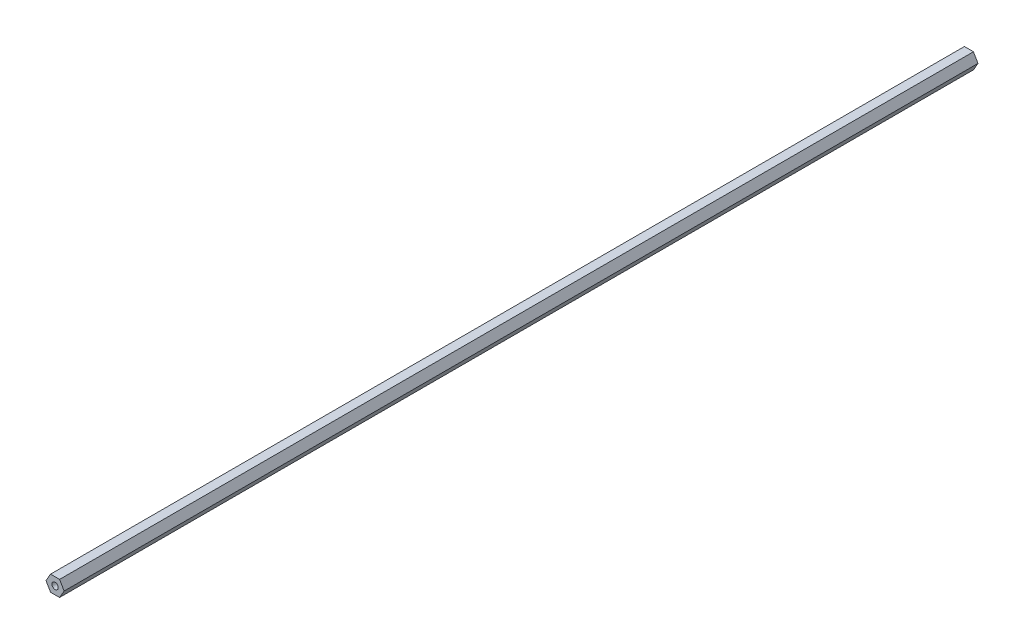
ISO-10303-21;
HEADER;
FILE_DESCRIPTION(('STEP AP214'),'2;1');
FILE_NAME('part.step','',(''),(''),'','','');
FILE_SCHEMA(('AUTOMOTIVE_DESIGN { 1 0 10303 214 1 1 1 1 }'));
ENDSEC;
DATA;
#1=APPLICATION_CONTEXT('core data for automotive mechanical design processes');
#2=APPLICATION_PROTOCOL_DEFINITION('international standard','automotive_design',2000,#1);
#3=PRODUCT_CONTEXT('',#1,'mechanical');
#4=PRODUCT('Part','Part','',(#3));
#5=PRODUCT_RELATED_PRODUCT_CATEGORY('part','',(#4));
#6=PRODUCT_DEFINITION_FORMATION('','',#4);
#7=PRODUCT_DEFINITION_CONTEXT('part definition',#1,'design');
#8=PRODUCT_DEFINITION('design','',#6,#7);
#9=PRODUCT_DEFINITION_SHAPE('','',#8);
#10=(LENGTH_UNIT() NAMED_UNIT(*) SI_UNIT(.MILLI.,.METRE.));
#11=(NAMED_UNIT(*) PLANE_ANGLE_UNIT() SI_UNIT($,.RADIAN.));
#12=(NAMED_UNIT(*) SI_UNIT($,.STERADIAN.) SOLID_ANGLE_UNIT());
#13=UNCERTAINTY_MEASURE_WITH_UNIT(LENGTH_MEASURE(1.E-05),#10,'distance_accuracy_value','');
#14=(GEOMETRIC_REPRESENTATION_CONTEXT(3) GLOBAL_UNCERTAINTY_ASSIGNED_CONTEXT((#13)) GLOBAL_UNIT_ASSIGNED_CONTEXT((#10,
#11,#12)) REPRESENTATION_CONTEXT('',''));
#15=CARTESIAN_POINT('',(0.,0.,0.));
#16=DIRECTION('',(0.,0.,1.));
#17=DIRECTION('',(1.,0.,0.));
#18=AXIS2_PLACEMENT_3D('',#15,#16,#17);
#19=CARTESIAN_POINT('',(0.,0.,739.648));
#20=DIRECTION('',(0.,0.,1.));
#21=DIRECTION('',(1.,0.,0.));
#22=AXIS2_PLACEMENT_3D('',#19,#20,#21);
#23=PLANE('',#22);
#24=DIRECTION('',(1.,0.,0.));
#25=VECTOR('',#24,1.);
#26=CARTESIAN_POINT('',(-3.66617420935412,-6.35,739.648));
#27=LINE('',#26,#25);
#28=CARTESIAN_POINT('',(-3.66617420935412,-6.35,739.648));
#29=VERTEX_POINT('',#28);
#30=CARTESIAN_POINT('',(3.66617420935413,-6.35,739.648));
#31=VERTEX_POINT('',#30);
#32=EDGE_CURVE('E152',#29,#31,#27,.T.);
#33=ORIENTED_EDGE('',*,*,#32,.T.);
#34=DIRECTION('',(0.5,0.866025403784439,0.));
#35=VECTOR('',#34,1.);
#36=CARTESIAN_POINT('',(3.66617420935413,-6.35,739.648));
#37=LINE('',#36,#35);
#38=CARTESIAN_POINT('',(7.33234841870825,0.,739.648));
#39=VERTEX_POINT('',#38);
#40=EDGE_CURVE('E100',#31,#39,#37,.T.);
#41=ORIENTED_EDGE('',*,*,#40,.T.);
#42=DIRECTION('',(-0.500000000000001,0.866025403784438,0.));
#43=VECTOR('',#42,1.);
#44=CARTESIAN_POINT('',(7.33234841870825,0.,739.648));
#45=LINE('',#44,#43);
#46=CARTESIAN_POINT('',(3.66617420935412,6.35,739.648));
#47=VERTEX_POINT('',#46);
#48=EDGE_CURVE('E113',#39,#47,#45,.T.);
#49=ORIENTED_EDGE('',*,*,#48,.T.);
#50=DIRECTION('',(-1.,0.,0.));
#51=VECTOR('',#50,1.);
#52=CARTESIAN_POINT('',(3.66617420935412,6.35,739.648));
#53=LINE('',#52,#51);
#54=CARTESIAN_POINT('',(-3.66617420935413,6.35,739.648));
#55=VERTEX_POINT('',#54);
#56=EDGE_CURVE('E107',#47,#55,#53,.T.);
#57=ORIENTED_EDGE('',*,*,#56,.T.);
#58=DIRECTION('',(-0.5,-0.866025403784439,0.));
#59=VECTOR('',#58,1.);
#60=CARTESIAN_POINT('',(-3.66617420935413,6.35,739.648));
#61=LINE('',#60,#59);
#62=CARTESIAN_POINT('',(-7.33234841870825,0.,739.648));
#63=VERTEX_POINT('',#62);
#64=EDGE_CURVE('E111',#55,#63,#61,.T.);
#65=ORIENTED_EDGE('',*,*,#64,.T.);
#66=DIRECTION('',(0.5,-0.866025403784438,0.));
#67=VECTOR('',#66,1.);
#68=CARTESIAN_POINT('',(-7.33234841870825,0.,739.648));
#69=LINE('',#68,#67);
#70=EDGE_CURVE('E63',#63,#29,#69,.T.);
#71=ORIENTED_EDGE('',*,*,#70,.T.);
#72=EDGE_LOOP('',(#33,#41,#49,#57,#65,#71));
#73=FACE_BOUND('',#72,.T.);
#74=CARTESIAN_POINT('',(0.,0.,739.648));
#75=DIRECTION('',(0.,0.,1.));
#76=DIRECTION('',(1.,0.,0.));
#77=AXIS2_PLACEMENT_3D('',#74,#75,#76);
#78=CIRCLE('',#77,2.5527);
#79=CARTESIAN_POINT('',(2.5527,0.,739.648));
#80=VERTEX_POINT('',#79);
#81=EDGE_CURVE('E140',#80,#80,#78,.T.);
#82=ORIENTED_EDGE('',*,*,#81,.F.);
#83=EDGE_LOOP('',(#82));
#84=FACE_BOUND('',#83,.T.);
#85=ADVANCED_FACE('F45',(#73,#84),#23,.T.);
#86=CARTESIAN_POINT('',(0.,0.,0.));
#87=DIRECTION('',(0.,0.,1.));
#88=DIRECTION('',(1.,0.,0.));
#89=AXIS2_PLACEMENT_3D('',#86,#87,#88);
#90=PLANE('',#89);
#91=DIRECTION('',(1.,0.,0.));
#92=VECTOR('',#91,1.);
#93=CARTESIAN_POINT('',(-3.66617420935412,-6.35,0.));
#94=LINE('',#93,#92);
#95=CARTESIAN_POINT('',(-3.66617420935412,-6.35,0.));
#96=VERTEX_POINT('',#95);
#97=CARTESIAN_POINT('',(3.66617420935413,-6.35,0.));
#98=VERTEX_POINT('',#97);
#99=EDGE_CURVE('E135',#96,#98,#94,.T.);
#100=ORIENTED_EDGE('',*,*,#99,.F.);
#101=DIRECTION('',(0.5,-0.866025403784438,0.));
#102=VECTOR('',#101,1.);
#103=CARTESIAN_POINT('',(-7.33234841870825,0.,0.));
#104=LINE('',#103,#102);
#105=CARTESIAN_POINT('',(-7.33234841870825,0.,0.));
#106=VERTEX_POINT('',#105);
#107=EDGE_CURVE('E92',#106,#96,#104,.T.);
#108=ORIENTED_EDGE('',*,*,#107,.F.);
#109=DIRECTION('',(-0.5,-0.866025403784439,0.));
#110=VECTOR('',#109,1.);
#111=CARTESIAN_POINT('',(-3.66617420935413,6.35,0.));
#112=LINE('',#111,#110);
#113=CARTESIAN_POINT('',(-3.66617420935413,6.35,0.));
#114=VERTEX_POINT('',#113);
#115=EDGE_CURVE('E86',#114,#106,#112,.T.);
#116=ORIENTED_EDGE('',*,*,#115,.F.);
#117=DIRECTION('',(-1.,0.,0.));
#118=VECTOR('',#117,1.);
#119=CARTESIAN_POINT('',(3.66617420935412,6.35,0.));
#120=LINE('',#119,#118);
#121=CARTESIAN_POINT('',(3.66617420935412,6.35,0.));
#122=VERTEX_POINT('',#121);
#123=EDGE_CURVE('E122',#122,#114,#120,.T.);
#124=ORIENTED_EDGE('',*,*,#123,.F.);
#125=DIRECTION('',(-0.500000000000001,0.866025403784438,0.));
#126=VECTOR('',#125,1.);
#127=CARTESIAN_POINT('',(7.33234841870825,0.,0.));
#128=LINE('',#127,#126);
#129=CARTESIAN_POINT('',(7.33234841870825,0.,0.));
#130=VERTEX_POINT('',#129);
#131=EDGE_CURVE('E143',#130,#122,#128,.T.);
#132=ORIENTED_EDGE('',*,*,#131,.F.);
#133=DIRECTION('',(0.5,0.866025403784439,0.));
#134=VECTOR('',#133,1.);
#135=CARTESIAN_POINT('',(3.66617420935413,-6.35,0.));
#136=LINE('',#135,#134);
#137=EDGE_CURVE('E139',#98,#130,#136,.T.);
#138=ORIENTED_EDGE('',*,*,#137,.F.);
#139=EDGE_LOOP('',(#100,#108,#116,#124,#132,#138));
#140=FACE_BOUND('',#139,.T.);
#141=CARTESIAN_POINT('',(0.,0.,0.));
#142=DIRECTION('',(0.,0.,1.));
#143=DIRECTION('',(1.,0.,0.));
#144=AXIS2_PLACEMENT_3D('',#141,#142,#143);
#145=CIRCLE('',#144,2.5527);
#146=CARTESIAN_POINT('',(2.5527,0.,0.));
#147=VERTEX_POINT('',#146);
#148=EDGE_CURVE('E249',#147,#147,#145,.T.);
#149=ORIENTED_EDGE('',*,*,#148,.T.);
#150=EDGE_LOOP('',(#149));
#151=FACE_BOUND('',#150,.T.);
#152=ADVANCED_FACE('F165',(#140,#151),#90,.F.);
#153=CARTESIAN_POINT('',(-3.66617420935412,-6.35,739.648));
#154=DIRECTION('',(0.,1.,0.));
#155=DIRECTION('',(-1.,0.,0.));
#156=AXIS2_PLACEMENT_3D('',#153,#154,#155);
#157=PLANE('',#156);
#158=ORIENTED_EDGE('',*,*,#99,.T.);
#159=DIRECTION('',(0.,0.,-1.));
#160=VECTOR('',#159,1.);
#161=CARTESIAN_POINT('',(3.66617420935413,-6.35,739.648));
#162=LINE('',#161,#160);
#163=EDGE_CURVE('E11',#31,#98,#162,.T.);
#164=ORIENTED_EDGE('',*,*,#163,.F.);
#165=ORIENTED_EDGE('',*,*,#32,.F.);
#166=DIRECTION('',(0.,0.,-1.));
#167=VECTOR('',#166,1.);
#168=CARTESIAN_POINT('',(-3.66617420935412,-6.35,739.648));
#169=LINE('',#168,#167);
#170=EDGE_CURVE('E131',#29,#96,#169,.T.);
#171=ORIENTED_EDGE('',*,*,#170,.T.);
#172=EDGE_LOOP('',(#158,#164,#165,#171));
#173=FACE_BOUND('',#172,.T.);
#174=ADVANCED_FACE('F47',(#173),#157,.F.);
#175=CARTESIAN_POINT('',(3.66617420935413,-6.35,739.648));
#176=DIRECTION('',(-0.866025403784439,0.5,0.));
#177=DIRECTION('',(-0.5,-0.866025403784439,0.));
#178=AXIS2_PLACEMENT_3D('',#175,#176,#177);
#179=PLANE('',#178);
#180=ORIENTED_EDGE('',*,*,#137,.T.);
#181=DIRECTION('',(0.,0.,-1.));
#182=VECTOR('',#181,1.);
#183=CARTESIAN_POINT('',(7.33234841870825,0.,739.648));
#184=LINE('',#183,#182);
#185=EDGE_CURVE('E55',#39,#130,#184,.T.);
#186=ORIENTED_EDGE('',*,*,#185,.F.);
#187=ORIENTED_EDGE('',*,*,#40,.F.);
#188=ORIENTED_EDGE('',*,*,#163,.T.);
#189=EDGE_LOOP('',(#180,#186,#187,#188));
#190=FACE_BOUND('',#189,.T.);
#191=ADVANCED_FACE('F190',(#190),#179,.F.);
#192=CARTESIAN_POINT('',(7.33234841870825,0.,739.648));
#193=DIRECTION('',(-0.866025403784438,-0.500000000000001,0.));
#194=DIRECTION('',(0.500000000000001,-0.866025403784438,0.));
#195=AXIS2_PLACEMENT_3D('',#192,#193,#194);
#196=PLANE('',#195);
#197=ORIENTED_EDGE('',*,*,#131,.T.);
#198=DIRECTION('',(0.,0.,-1.));
#199=VECTOR('',#198,1.);
#200=CARTESIAN_POINT('',(3.66617420935412,6.35,739.648));
#201=LINE('',#200,#199);
#202=EDGE_CURVE('E124',#47,#122,#201,.T.);
#203=ORIENTED_EDGE('',*,*,#202,.F.);
#204=ORIENTED_EDGE('',*,*,#48,.F.);
#205=ORIENTED_EDGE('',*,*,#185,.T.);
#206=EDGE_LOOP('',(#197,#203,#204,#205));
#207=FACE_BOUND('',#206,.T.);
#208=ADVANCED_FACE('F162',(#207),#196,.F.);
#209=CARTESIAN_POINT('',(3.66617420935412,6.35,739.648));
#210=DIRECTION('',(0.,-1.,0.));
#211=DIRECTION('',(1.,0.,0.));
#212=AXIS2_PLACEMENT_3D('',#209,#210,#211);
#213=PLANE('',#212);
#214=ORIENTED_EDGE('',*,*,#123,.T.);
#215=DIRECTION('',(0.,0.,-1.));
#216=VECTOR('',#215,1.);
#217=CARTESIAN_POINT('',(-3.66617420935413,6.35,739.648));
#218=LINE('',#217,#216);
#219=EDGE_CURVE('E119',#55,#114,#218,.T.);
#220=ORIENTED_EDGE('',*,*,#219,.F.);
#221=ORIENTED_EDGE('',*,*,#56,.F.);
#222=ORIENTED_EDGE('',*,*,#202,.T.);
#223=EDGE_LOOP('',(#214,#220,#221,#222));
#224=FACE_BOUND('',#223,.T.);
#225=ADVANCED_FACE('F120',(#224),#213,.F.);
#226=CARTESIAN_POINT('',(-3.66617420935413,6.35,739.648));
#227=DIRECTION('',(0.866025403784439,-0.5,0.));
#228=DIRECTION('',(0.5,0.866025403784439,0.));
#229=AXIS2_PLACEMENT_3D('',#226,#227,#228);
#230=PLANE('',#229);
#231=ORIENTED_EDGE('',*,*,#115,.T.);
#232=DIRECTION('',(0.,0.,-1.));
#233=VECTOR('',#232,1.);
#234=CARTESIAN_POINT('',(-7.33234841870825,0.,739.648));
#235=LINE('',#234,#233);
#236=EDGE_CURVE('E125',#63,#106,#235,.T.);
#237=ORIENTED_EDGE('',*,*,#236,.F.);
#238=ORIENTED_EDGE('',*,*,#64,.F.);
#239=ORIENTED_EDGE('',*,*,#219,.T.);
#240=EDGE_LOOP('',(#231,#237,#238,#239));
#241=FACE_BOUND('',#240,.T.);
#242=ADVANCED_FACE('F127',(#241),#230,.F.);
#243=CARTESIAN_POINT('',(-7.33234841870825,0.,739.648));
#244=DIRECTION('',(0.866025403784438,0.5,0.));
#245=DIRECTION('',(-0.5,0.866025403784439,0.));
#246=AXIS2_PLACEMENT_3D('',#243,#244,#245);
#247=PLANE('',#246);
#248=ORIENTED_EDGE('',*,*,#107,.T.);
#249=ORIENTED_EDGE('',*,*,#170,.F.);
#250=ORIENTED_EDGE('',*,*,#70,.F.);
#251=ORIENTED_EDGE('',*,*,#236,.T.);
#252=EDGE_LOOP('',(#248,#249,#250,#251));
#253=FACE_BOUND('',#252,.T.);
#254=ADVANCED_FACE('F170',(#253),#247,.F.);
#255=CARTESIAN_POINT('',(0.,0.,739.648));
#256=DIRECTION('',(0.,0.,-1.));
#257=DIRECTION('',(-1.,0.,0.));
#258=AXIS2_PLACEMENT_3D('',#255,#256,#257);
#259=CYLINDRICAL_SURFACE('',#258,2.5527);
#260=ORIENTED_EDGE('',*,*,#81,.T.);
#261=EDGE_LOOP('',(#260));
#262=FACE_BOUND('',#261,.T.);
#263=ORIENTED_EDGE('',*,*,#148,.F.);
#264=EDGE_LOOP('',(#263));
#265=FACE_BOUND('',#264,.T.);
#266=ADVANCED_FACE('F172',(#262,#265),#259,.F.);
#267=CLOSED_SHELL('',(#85,#152,#174,#191,#208,#225,#242,#254,#266));
#268=MANIFOLD_SOLID_BREP('B2',#267);
#269=ADVANCED_BREP_SHAPE_REPRESENTATION('',(#18,#268),#14);
#270=SHAPE_DEFINITION_REPRESENTATION(#9,#269);
ENDSEC;
END-ISO-10303-21;
